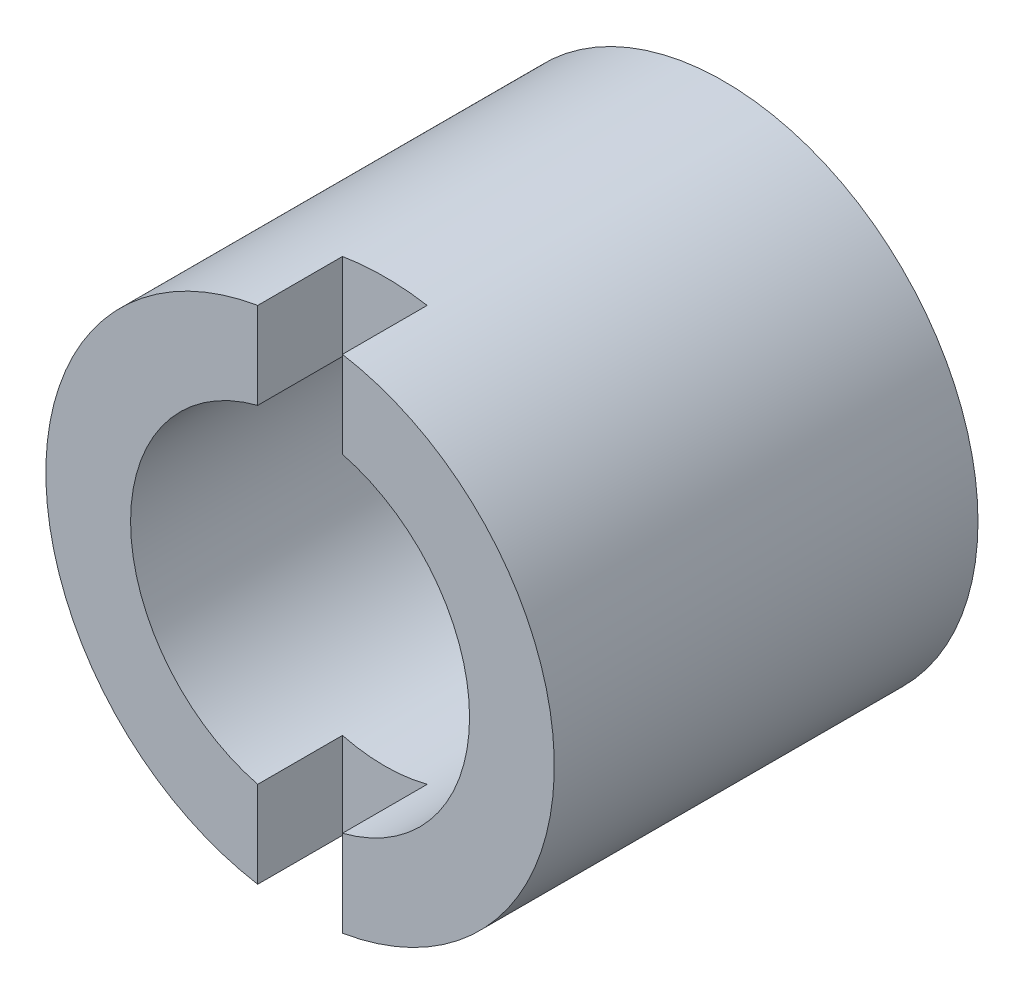
ISO-10303-21;
HEADER;
FILE_DESCRIPTION(('STEP AP214'),'2;1');
FILE_NAME('part.step','',(''),(''),'','','');
FILE_SCHEMA(('AUTOMOTIVE_DESIGN { 1 0 10303 214 1 1 1 1 }'));
ENDSEC;
DATA;
#1=APPLICATION_CONTEXT('core data for automotive mechanical design processes');
#2=APPLICATION_PROTOCOL_DEFINITION('international standard','automotive_design',2000,#1);
#3=PRODUCT_CONTEXT('',#1,'mechanical');
#4=PRODUCT('Part','Part','',(#3));
#5=PRODUCT_RELATED_PRODUCT_CATEGORY('part','',(#4));
#6=PRODUCT_DEFINITION_FORMATION('','',#4);
#7=PRODUCT_DEFINITION_CONTEXT('part definition',#1,'design');
#8=PRODUCT_DEFINITION('design','',#6,#7);
#9=PRODUCT_DEFINITION_SHAPE('','',#8);
#10=(LENGTH_UNIT() NAMED_UNIT(*) SI_UNIT(.MILLI.,.METRE.));
#11=(NAMED_UNIT(*) PLANE_ANGLE_UNIT() SI_UNIT($,.RADIAN.));
#12=(NAMED_UNIT(*) SI_UNIT($,.STERADIAN.) SOLID_ANGLE_UNIT());
#13=UNCERTAINTY_MEASURE_WITH_UNIT(LENGTH_MEASURE(1.E-05),#10,'distance_accuracy_value','');
#14=(GEOMETRIC_REPRESENTATION_CONTEXT(3) GLOBAL_UNCERTAINTY_ASSIGNED_CONTEXT((#13)) GLOBAL_UNIT_ASSIGNED_CONTEXT((#10,
#11,#12)) REPRESENTATION_CONTEXT('',''));
#15=CARTESIAN_POINT('',(0.,0.,0.));
#16=DIRECTION('',(0.,0.,1.));
#17=DIRECTION('',(1.,0.,0.));
#18=AXIS2_PLACEMENT_3D('',#15,#16,#17);
#19=CARTESIAN_POINT('',(0.,0.,10.));
#20=DIRECTION('',(0.,0.,1.));
#21=DIRECTION('',(1.,0.,0.));
#22=AXIS2_PLACEMENT_3D('',#19,#20,#21);
#23=PLANE('',#22);
#24=DIRECTION('',(0.,1.,0.));
#25=VECTOR('',#24,1.);
#26=CARTESIAN_POINT('',(0.999999999999999,-6.,10.));
#27=LINE('',#26,#25);
#28=CARTESIAN_POINT('',(0.999999999999999,-5.91607978309962,10.));
#29=VERTEX_POINT('',#28);
#30=CARTESIAN_POINT('',(0.999999999999999,-3.87298334620742,10.));
#31=VERTEX_POINT('',#30);
#32=EDGE_CURVE('E115',#29,#31,#27,.T.);
#33=ORIENTED_EDGE('',*,*,#32,.F.);
#34=CARTESIAN_POINT('',(0.,0.,10.));
#35=DIRECTION('',(0.,0.,1.));
#36=DIRECTION('',(1.,0.,0.));
#37=AXIS2_PLACEMENT_3D('',#34,#35,#36);
#38=CIRCLE('',#37,6.);
#39=CARTESIAN_POINT('',(0.999999999999999,5.91607978309962,10.));
#40=VERTEX_POINT('',#39);
#41=EDGE_CURVE('E152',#29,#40,#38,.T.);
#42=ORIENTED_EDGE('',*,*,#41,.T.);
#43=CARTESIAN_POINT('',(0.999999999999999,3.87298334620742,10.));
#44=VERTEX_POINT('',#43);
#45=EDGE_CURVE('E175',#44,#40,#27,.T.);
#46=ORIENTED_EDGE('',*,*,#45,.F.);
#47=CARTESIAN_POINT('',(0.,0.,10.));
#48=DIRECTION('',(0.,0.,1.));
#49=DIRECTION('',(1.,0.,0.));
#50=AXIS2_PLACEMENT_3D('',#47,#48,#49);
#51=CIRCLE('',#50,4.);
#52=EDGE_CURVE('E144',#31,#44,#51,.T.);
#53=ORIENTED_EDGE('',*,*,#52,.F.);
#54=EDGE_LOOP('',(#33,#42,#46,#53));
#55=FACE_BOUND('',#54,.T.);
#56=ADVANCED_FACE('F40',(#55),#23,.T.);
#57=CARTESIAN_POINT('',(0.,0.,10.));
#58=DIRECTION('',(0.,0.,-1.));
#59=DIRECTION('',(-1.,0.,0.));
#60=AXIS2_PLACEMENT_3D('',#57,#58,#59);
#61=CYLINDRICAL_SURFACE('',#60,6.);
#62=CARTESIAN_POINT('',(-1.,5.91607978309961,10.));
#63=VERTEX_POINT('',#62);
#64=CARTESIAN_POINT('',(-1.,-5.91607978309962,10.));
#65=VERTEX_POINT('',#64);
#66=EDGE_CURVE('E155',#63,#65,#38,.T.);
#67=ORIENTED_EDGE('',*,*,#66,.F.);
#68=DIRECTION('',(0.,0.,-1.));
#69=VECTOR('',#68,1.);
#70=CARTESIAN_POINT('',(-1.,5.91607978309962,10.));
#71=LINE('',#70,#69);
#72=CARTESIAN_POINT('',(-1.,5.91607978309962,8.));
#73=VERTEX_POINT('',#72);
#74=EDGE_CURVE('E124',#63,#73,#71,.T.);
#75=ORIENTED_EDGE('',*,*,#74,.T.);
#76=CARTESIAN_POINT('',(0.,0.,8.));
#77=DIRECTION('',(0.,0.,-1.));
#78=DIRECTION('',(-1.,0.,0.));
#79=AXIS2_PLACEMENT_3D('',#76,#77,#78);
#80=CIRCLE('',#79,6.);
#81=CARTESIAN_POINT('',(1.,5.91607978309962,8.));
#82=VERTEX_POINT('',#81);
#83=EDGE_CURVE('E114',#73,#82,#80,.T.);
#84=ORIENTED_EDGE('',*,*,#83,.T.);
#85=DIRECTION('',(0.,0.,-1.));
#86=VECTOR('',#85,1.);
#87=CARTESIAN_POINT('',(0.999999999999999,5.91607978309962,10.));
#88=LINE('',#87,#86);
#89=EDGE_CURVE('E140',#82,#40,#88,.F.);
#90=ORIENTED_EDGE('',*,*,#89,.T.);
#91=ORIENTED_EDGE('',*,*,#41,.F.);
#92=DIRECTION('',(0.,0.,-1.));
#93=VECTOR('',#92,1.);
#94=CARTESIAN_POINT('',(0.999999999999999,-5.91607978309962,10.));
#95=LINE('',#94,#93);
#96=CARTESIAN_POINT('',(1.,-5.91607978309962,8.));
#97=VERTEX_POINT('',#96);
#98=EDGE_CURVE('E112',#29,#97,#95,.T.);
#99=ORIENTED_EDGE('',*,*,#98,.T.);
#100=CARTESIAN_POINT('',(-1.,-5.91607978309962,8.));
#101=VERTEX_POINT('',#100);
#102=EDGE_CURVE('E105',#97,#101,#80,.T.);
#103=ORIENTED_EDGE('',*,*,#102,.T.);
#104=DIRECTION('',(0.,0.,-1.));
#105=VECTOR('',#104,1.);
#106=CARTESIAN_POINT('',(-1.,-5.91607978309962,10.));
#107=LINE('',#106,#105);
#108=EDGE_CURVE('E109',#101,#65,#107,.F.);
#109=ORIENTED_EDGE('',*,*,#108,.T.);
#110=EDGE_LOOP('',(#67,#75,#84,#90,#91,#99,#103,#109));
#111=FACE_BOUND('',#110,.T.);
#112=CARTESIAN_POINT('',(0.,0.,0.));
#113=DIRECTION('',(0.,0.,1.));
#114=DIRECTION('',(1.,0.,0.));
#115=AXIS2_PLACEMENT_3D('',#112,#113,#114);
#116=CIRCLE('',#115,6.);
#117=CARTESIAN_POINT('',(6.,0.,0.));
#118=VERTEX_POINT('',#117);
#119=EDGE_CURVE('E148',#118,#118,#116,.T.);
#120=ORIENTED_EDGE('',*,*,#119,.T.);
#121=EDGE_LOOP('',(#120));
#122=FACE_BOUND('',#121,.T.);
#123=ADVANCED_FACE('F42',(#111,#122),#61,.T.);
#124=DIRECTION('',(0.,1.,0.));
#125=VECTOR('',#124,1.);
#126=CARTESIAN_POINT('',(-1.,-6.,10.));
#127=LINE('',#126,#125);
#128=CARTESIAN_POINT('',(-1.,3.87298334620741,10.));
#129=VERTEX_POINT('',#128);
#130=EDGE_CURVE('E129',#129,#63,#127,.T.);
#131=ORIENTED_EDGE('',*,*,#130,.T.);
#132=ORIENTED_EDGE('',*,*,#66,.T.);
#133=CARTESIAN_POINT('',(-1.,-3.87298334620742,10.));
#134=VERTEX_POINT('',#133);
#135=EDGE_CURVE('E123',#65,#134,#127,.T.);
#136=ORIENTED_EDGE('',*,*,#135,.T.);
#137=EDGE_CURVE('E149',#129,#134,#51,.T.);
#138=ORIENTED_EDGE('',*,*,#137,.F.);
#139=EDGE_LOOP('',(#131,#132,#136,#138));
#140=FACE_BOUND('',#139,.T.);
#141=ADVANCED_FACE('F180',(#140),#23,.T.);
#142=CARTESIAN_POINT('',(0.,0.,0.));
#143=DIRECTION('',(0.,0.,1.));
#144=DIRECTION('',(1.,0.,0.));
#145=AXIS2_PLACEMENT_3D('',#142,#143,#144);
#146=PLANE('',#145);
#147=CARTESIAN_POINT('',(0.,0.,0.));
#148=DIRECTION('',(0.,0.,1.));
#149=DIRECTION('',(1.,0.,0.));
#150=AXIS2_PLACEMENT_3D('',#147,#148,#149);
#151=CIRCLE('',#150,4.);
#152=CARTESIAN_POINT('',(4.,0.,0.));
#153=VERTEX_POINT('',#152);
#154=EDGE_CURVE('E145',#153,#153,#151,.T.);
#155=ORIENTED_EDGE('',*,*,#154,.T.);
#156=EDGE_LOOP('',(#155));
#157=FACE_BOUND('',#156,.T.);
#158=ORIENTED_EDGE('',*,*,#119,.F.);
#159=EDGE_LOOP('',(#158));
#160=FACE_BOUND('',#159,.T.);
#161=ADVANCED_FACE('F193',(#157,#160),#146,.F.);
#162=CARTESIAN_POINT('',(0.,0.,0.));
#163=DIRECTION('',(0.,0.,1.));
#164=DIRECTION('',(1.,0.,0.));
#165=AXIS2_PLACEMENT_3D('',#162,#163,#164);
#166=CYLINDRICAL_SURFACE('',#165,4.);
#167=CARTESIAN_POINT('',(0.,0.,8.));
#168=DIRECTION('',(0.,0.,-1.));
#169=DIRECTION('',(-1.,0.,0.));
#170=AXIS2_PLACEMENT_3D('',#167,#168,#169);
#171=CIRCLE('',#170,4.);
#172=CARTESIAN_POINT('',(-1.,-3.87298334620742,8.));
#173=VERTEX_POINT('',#172);
#174=CARTESIAN_POINT('',(1.,-3.87298334620742,8.));
#175=VERTEX_POINT('',#174);
#176=EDGE_CURVE('E128',#173,#175,#171,.F.);
#177=ORIENTED_EDGE('',*,*,#176,.T.);
#178=DIRECTION('',(0.,0.,1.));
#179=VECTOR('',#178,1.);
#180=CARTESIAN_POINT('',(1.,-3.87298334620742,0.));
#181=LINE('',#180,#179);
#182=EDGE_CURVE('E12',#175,#31,#181,.T.);
#183=ORIENTED_EDGE('',*,*,#182,.T.);
#184=ORIENTED_EDGE('',*,*,#52,.T.);
#185=DIRECTION('',(0.,0.,1.));
#186=VECTOR('',#185,1.);
#187=CARTESIAN_POINT('',(1.,3.87298334620742,0.));
#188=LINE('',#187,#186);
#189=CARTESIAN_POINT('',(1.,3.87298334620742,8.));
#190=VERTEX_POINT('',#189);
#191=EDGE_CURVE('E164',#44,#190,#188,.F.);
#192=ORIENTED_EDGE('',*,*,#191,.T.);
#193=CARTESIAN_POINT('',(-1.,3.87298334620742,8.));
#194=VERTEX_POINT('',#193);
#195=EDGE_CURVE('E158',#190,#194,#171,.F.);
#196=ORIENTED_EDGE('',*,*,#195,.T.);
#197=DIRECTION('',(0.,0.,1.));
#198=VECTOR('',#197,1.);
#199=CARTESIAN_POINT('',(-1.,3.87298334620742,0.));
#200=LINE('',#199,#198);
#201=EDGE_CURVE('E161',#194,#129,#200,.T.);
#202=ORIENTED_EDGE('',*,*,#201,.T.);
#203=ORIENTED_EDGE('',*,*,#137,.T.);
#204=DIRECTION('',(0.,0.,1.));
#205=VECTOR('',#204,1.);
#206=CARTESIAN_POINT('',(-1.,-3.87298334620742,0.));
#207=LINE('',#206,#205);
#208=EDGE_CURVE('E48',#134,#173,#207,.F.);
#209=ORIENTED_EDGE('',*,*,#208,.T.);
#210=EDGE_LOOP('',(#177,#183,#184,#192,#196,#202,#203,#209));
#211=FACE_BOUND('',#210,.T.);
#212=ORIENTED_EDGE('',*,*,#154,.F.);
#213=EDGE_LOOP('',(#212));
#214=FACE_BOUND('',#213,.T.);
#215=ADVANCED_FACE('F168',(#211,#214),#166,.F.);
#216=CARTESIAN_POINT('',(-1.,-6.,8.));
#217=DIRECTION('',(0.,0.,-1.));
#218=DIRECTION('',(-1.,0.,0.));
#219=AXIS2_PLACEMENT_3D('',#216,#217,#218);
#220=PLANE('',#219);
#221=DIRECTION('',(0.,1.,0.));
#222=VECTOR('',#221,1.);
#223=CARTESIAN_POINT('',(-1.,-6.,8.));
#224=LINE('',#223,#222);
#225=EDGE_CURVE('E63',#194,#73,#224,.T.);
#226=ORIENTED_EDGE('',*,*,#225,.F.);
#227=ORIENTED_EDGE('',*,*,#195,.F.);
#228=DIRECTION('',(0.,1.,0.));
#229=VECTOR('',#228,1.);
#230=CARTESIAN_POINT('',(1.,-6.,8.));
#231=LINE('',#230,#229);
#232=EDGE_CURVE('E135',#190,#82,#231,.T.);
#233=ORIENTED_EDGE('',*,*,#232,.T.);
#234=ORIENTED_EDGE('',*,*,#83,.F.);
#235=EDGE_LOOP('',(#226,#227,#233,#234));
#236=FACE_BOUND('',#235,.T.);
#237=ADVANCED_FACE('F185',(#236),#220,.F.);
#238=CARTESIAN_POINT('',(-1.,-6.,8.));
#239=DIRECTION('',(-1.,0.,0.));
#240=DIRECTION('',(0.,0.,1.));
#241=AXIS2_PLACEMENT_3D('',#238,#239,#240);
#242=PLANE('',#241);
#243=ORIENTED_EDGE('',*,*,#130,.F.);
#244=ORIENTED_EDGE('',*,*,#201,.F.);
#245=ORIENTED_EDGE('',*,*,#225,.T.);
#246=ORIENTED_EDGE('',*,*,#74,.F.);
#247=EDGE_LOOP('',(#243,#244,#245,#246));
#248=FACE_BOUND('',#247,.T.);
#249=ADVANCED_FACE('F182',(#248),#242,.F.);
#250=CARTESIAN_POINT('',(1.,-6.,8.));
#251=DIRECTION('',(1.,0.,0.));
#252=DIRECTION('',(0.,0.,-1.));
#253=AXIS2_PLACEMENT_3D('',#250,#251,#252);
#254=PLANE('',#253);
#255=ORIENTED_EDGE('',*,*,#232,.F.);
#256=ORIENTED_EDGE('',*,*,#191,.F.);
#257=ORIENTED_EDGE('',*,*,#45,.T.);
#258=ORIENTED_EDGE('',*,*,#89,.F.);
#259=EDGE_LOOP('',(#255,#256,#257,#258));
#260=FACE_BOUND('',#259,.T.);
#261=ADVANCED_FACE('F184',(#260),#254,.F.);
#262=ORIENTED_EDGE('',*,*,#32,.T.);
#263=ORIENTED_EDGE('',*,*,#182,.F.);
#264=EDGE_CURVE('E55',#97,#175,#231,.T.);
#265=ORIENTED_EDGE('',*,*,#264,.F.);
#266=ORIENTED_EDGE('',*,*,#98,.F.);
#267=EDGE_LOOP('',(#262,#263,#265,#266));
#268=FACE_BOUND('',#267,.T.);
#269=ADVANCED_FACE('F246',(#268),#254,.F.);
#270=EDGE_CURVE('E120',#101,#173,#224,.T.);
#271=ORIENTED_EDGE('',*,*,#270,.T.);
#272=ORIENTED_EDGE('',*,*,#208,.F.);
#273=ORIENTED_EDGE('',*,*,#135,.F.);
#274=ORIENTED_EDGE('',*,*,#108,.F.);
#275=EDGE_LOOP('',(#271,#272,#273,#274));
#276=FACE_BOUND('',#275,.T.);
#277=ADVANCED_FACE('F119',(#276),#242,.F.);
#278=ORIENTED_EDGE('',*,*,#264,.T.);
#279=ORIENTED_EDGE('',*,*,#176,.F.);
#280=ORIENTED_EDGE('',*,*,#270,.F.);
#281=ORIENTED_EDGE('',*,*,#102,.F.);
#282=EDGE_LOOP('',(#278,#279,#280,#281));
#283=FACE_BOUND('',#282,.T.);
#284=ADVANCED_FACE('F126',(#283),#220,.F.);
#285=CLOSED_SHELL('',(#56,#123,#141,#161,#215,#237,#249,#261,#269,#277,#284));
#286=MANIFOLD_SOLID_BREP('B2',#285);
#287=ADVANCED_BREP_SHAPE_REPRESENTATION('',(#18,#286),#14);
#288=SHAPE_DEFINITION_REPRESENTATION(#9,#287);
ENDSEC;
END-ISO-10303-21;
